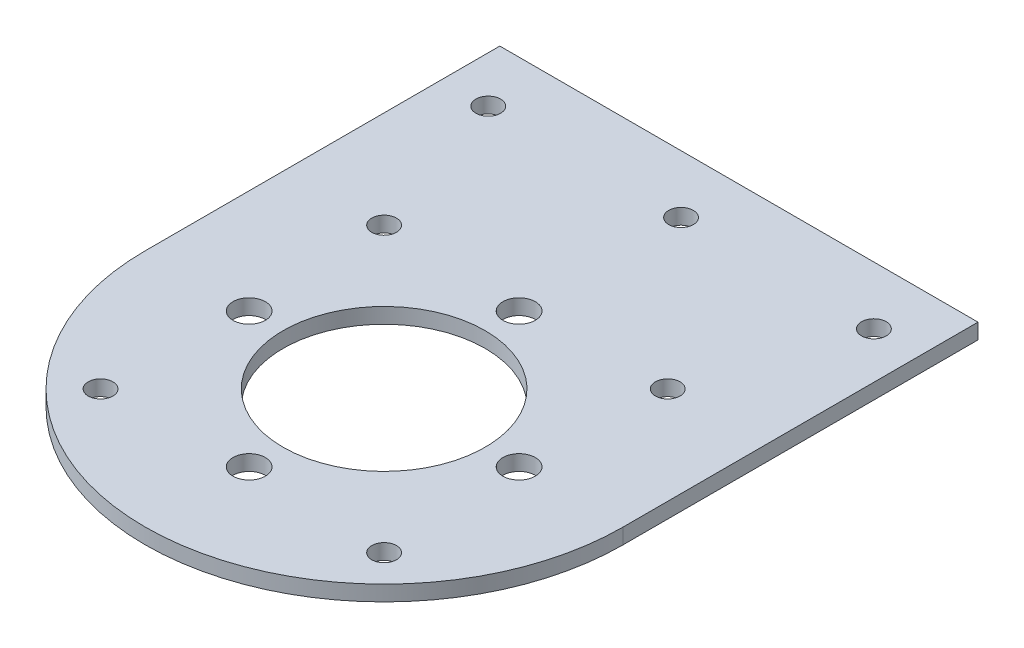
ISO-10303-21;
HEADER;
FILE_DESCRIPTION(('STEP AP214'),'2;1');
FILE_NAME('part.step','',(''),(''),'','','');
FILE_SCHEMA(('AUTOMOTIVE_DESIGN { 1 0 10303 214 1 1 1 1 }'));
ENDSEC;
DATA;
#1=APPLICATION_CONTEXT('core data for automotive mechanical design processes');
#2=APPLICATION_PROTOCOL_DEFINITION('international standard','automotive_design',2000,#1);
#3=PRODUCT_CONTEXT('',#1,'mechanical');
#4=PRODUCT('Part','Part','',(#3));
#5=PRODUCT_RELATED_PRODUCT_CATEGORY('part','',(#4));
#6=PRODUCT_DEFINITION_FORMATION('','',#4);
#7=PRODUCT_DEFINITION_CONTEXT('part definition',#1,'design');
#8=PRODUCT_DEFINITION('design','',#6,#7);
#9=PRODUCT_DEFINITION_SHAPE('','',#8);
#10=(LENGTH_UNIT() NAMED_UNIT(*) SI_UNIT(.MILLI.,.METRE.));
#11=(NAMED_UNIT(*) PLANE_ANGLE_UNIT() SI_UNIT($,.RADIAN.));
#12=(NAMED_UNIT(*) SI_UNIT($,.STERADIAN.) SOLID_ANGLE_UNIT());
#13=UNCERTAINTY_MEASURE_WITH_UNIT(LENGTH_MEASURE(1.E-05),#10,'distance_accuracy_value','');
#14=(GEOMETRIC_REPRESENTATION_CONTEXT(3) GLOBAL_UNCERTAINTY_ASSIGNED_CONTEXT((#13)) GLOBAL_UNIT_ASSIGNED_CONTEXT((#10,
#11,#12)) REPRESENTATION_CONTEXT('',''));
#15=CARTESIAN_POINT('',(0.,0.,0.));
#16=DIRECTION('',(0.,0.,1.));
#17=DIRECTION('',(1.,0.,0.));
#18=AXIS2_PLACEMENT_3D('',#15,#16,#17);
#19=CARTESIAN_POINT('',(-31.,2.,0.));
#20=DIRECTION('',(-1.,0.,0.));
#21=DIRECTION('',(0.,0.,1.));
#22=AXIS2_PLACEMENT_3D('',#19,#20,#21);
#23=PLANE('',#22);
#24=DIRECTION('',(0.,0.,-1.));
#25=VECTOR('',#24,1.);
#26=CARTESIAN_POINT('',(-31.,0.,0.));
#27=LINE('',#26,#25);
#28=CARTESIAN_POINT('',(-31.,0.,0.));
#29=VERTEX_POINT('',#28);
#30=CARTESIAN_POINT('',(-31.,0.,-46.));
#31=VERTEX_POINT('',#30);
#32=EDGE_CURVE('E164',#29,#31,#27,.T.);
#33=ORIENTED_EDGE('',*,*,#32,.F.);
#34=DIRECTION('',(0.,-1.,0.));
#35=VECTOR('',#34,1.);
#36=CARTESIAN_POINT('',(-31.,2.,0.));
#37=LINE('',#36,#35);
#38=CARTESIAN_POINT('',(-31.,2.,0.));
#39=VERTEX_POINT('',#38);
#40=EDGE_CURVE('E11',#39,#29,#37,.T.);
#41=ORIENTED_EDGE('',*,*,#40,.F.);
#42=DIRECTION('',(0.,0.,-1.));
#43=VECTOR('',#42,1.);
#44=CARTESIAN_POINT('',(-31.,2.,0.));
#45=LINE('',#44,#43);
#46=CARTESIAN_POINT('',(-31.,2.,-46.));
#47=VERTEX_POINT('',#46);
#48=EDGE_CURVE('E97',#39,#47,#45,.T.);
#49=ORIENTED_EDGE('',*,*,#48,.T.);
#50=DIRECTION('',(0.,-1.,0.));
#51=VECTOR('',#50,1.);
#52=CARTESIAN_POINT('',(-31.,2.,-46.));
#53=LINE('',#52,#51);
#54=EDGE_CURVE('E64',#47,#31,#53,.T.);
#55=ORIENTED_EDGE('',*,*,#54,.T.);
#56=EDGE_LOOP('',(#33,#41,#49,#55));
#57=FACE_BOUND('',#56,.T.);
#58=ADVANCED_FACE('F46',(#57),#23,.T.);
#59=CARTESIAN_POINT('',(0.,2.,0.));
#60=DIRECTION('',(0.,-1.,0.));
#61=DIRECTION('',(0.,0.,-1.));
#62=AXIS2_PLACEMENT_3D('',#59,#60,#61);
#63=CYLINDRICAL_SURFACE('',#62,31.);
#64=CARTESIAN_POINT('',(0.,0.,0.));
#65=DIRECTION('',(0.,1.,0.));
#66=DIRECTION('',(0.,0.,1.));
#67=AXIS2_PLACEMENT_3D('',#64,#65,#66);
#68=CIRCLE('',#67,31.);
#69=CARTESIAN_POINT('',(31.,0.,0.));
#70=VERTEX_POINT('',#69);
#71=EDGE_CURVE('E104',#29,#70,#68,.T.);
#72=ORIENTED_EDGE('',*,*,#71,.T.);
#73=DIRECTION('',(0.,-1.,0.));
#74=VECTOR('',#73,1.);
#75=CARTESIAN_POINT('',(31.,2.,0.));
#76=LINE('',#75,#74);
#77=CARTESIAN_POINT('',(31.,2.,0.));
#78=VERTEX_POINT('',#77);
#79=EDGE_CURVE('E56',#78,#70,#76,.T.);
#80=ORIENTED_EDGE('',*,*,#79,.F.);
#81=CARTESIAN_POINT('',(0.,2.,0.));
#82=DIRECTION('',(0.,1.,0.));
#83=DIRECTION('',(0.,0.,1.));
#84=AXIS2_PLACEMENT_3D('',#81,#82,#83);
#85=CIRCLE('',#84,31.);
#86=EDGE_CURVE('E90',#39,#78,#85,.T.);
#87=ORIENTED_EDGE('',*,*,#86,.F.);
#88=ORIENTED_EDGE('',*,*,#40,.T.);
#89=EDGE_LOOP('',(#72,#80,#87,#88));
#90=FACE_BOUND('',#89,.T.);
#91=ADVANCED_FACE('F102',(#90),#63,.T.);
#92=CARTESIAN_POINT('',(31.,2.,0.));
#93=DIRECTION('',(1.,0.,0.));
#94=DIRECTION('',(0.,0.,-1.));
#95=AXIS2_PLACEMENT_3D('',#92,#93,#94);
#96=PLANE('',#95);
#97=DIRECTION('',(0.,0.,1.));
#98=VECTOR('',#97,1.);
#99=CARTESIAN_POINT('',(31.,0.,0.));
#100=LINE('',#99,#98);
#101=CARTESIAN_POINT('',(31.,0.,-46.));
#102=VERTEX_POINT('',#101);
#103=EDGE_CURVE('E169',#102,#70,#100,.T.);
#104=ORIENTED_EDGE('',*,*,#103,.F.);
#105=DIRECTION('',(0.,-1.,0.));
#106=VECTOR('',#105,1.);
#107=CARTESIAN_POINT('',(31.,2.,-46.));
#108=LINE('',#107,#106);
#109=CARTESIAN_POINT('',(31.,2.,-46.));
#110=VERTEX_POINT('',#109);
#111=EDGE_CURVE('E77',#110,#102,#108,.T.);
#112=ORIENTED_EDGE('',*,*,#111,.F.);
#113=DIRECTION('',(0.,0.,1.));
#114=VECTOR('',#113,1.);
#115=CARTESIAN_POINT('',(31.,2.,0.));
#116=LINE('',#115,#114);
#117=EDGE_CURVE('E96',#110,#78,#116,.T.);
#118=ORIENTED_EDGE('',*,*,#117,.T.);
#119=ORIENTED_EDGE('',*,*,#79,.T.);
#120=EDGE_LOOP('',(#104,#112,#118,#119));
#121=FACE_BOUND('',#120,.T.);
#122=ADVANCED_FACE('F108',(#121),#96,.T.);
#123=CARTESIAN_POINT('',(0.,2.,-17.5));
#124=DIRECTION('',(0.,-1.,0.));
#125=DIRECTION('',(0.,0.,-1.));
#126=AXIS2_PLACEMENT_3D('',#123,#124,#125);
#127=CYLINDRICAL_SURFACE('',#126,2.1);
#128=CARTESIAN_POINT('',(0.,2.,-17.5));
#129=DIRECTION('',(0.,1.,0.));
#130=DIRECTION('',(0.,0.,1.));
#131=AXIS2_PLACEMENT_3D('',#128,#129,#130);
#132=CIRCLE('',#131,2.1);
#133=CARTESIAN_POINT('',(0.,2.,-15.4));
#134=VERTEX_POINT('',#133);
#135=EDGE_CURVE('E144',#134,#134,#132,.T.);
#136=ORIENTED_EDGE('',*,*,#135,.T.);
#137=EDGE_LOOP('',(#136));
#138=FACE_BOUND('',#137,.T.);
#139=CARTESIAN_POINT('',(0.,0.,-17.5));
#140=DIRECTION('',(0.,1.,0.));
#141=DIRECTION('',(0.,0.,1.));
#142=AXIS2_PLACEMENT_3D('',#139,#140,#141);
#143=CIRCLE('',#142,2.1);
#144=CARTESIAN_POINT('',(0.,0.,-15.4));
#145=VERTEX_POINT('',#144);
#146=EDGE_CURVE('E204',#145,#145,#143,.T.);
#147=ORIENTED_EDGE('',*,*,#146,.F.);
#148=EDGE_LOOP('',(#147));
#149=FACE_BOUND('',#148,.T.);
#150=ADVANCED_FACE('F288',(#138,#149),#127,.F.);
#151=CARTESIAN_POINT('',(-17.5,2.,0.));
#152=DIRECTION('',(0.,-1.,0.));
#153=DIRECTION('',(0.,0.,-1.));
#154=AXIS2_PLACEMENT_3D('',#151,#152,#153);
#155=CYLINDRICAL_SURFACE('',#154,2.1);
#156=CARTESIAN_POINT('',(-17.5,2.,0.));
#157=DIRECTION('',(0.,1.,0.));
#158=DIRECTION('',(0.,0.,1.));
#159=AXIS2_PLACEMENT_3D('',#156,#157,#158);
#160=CIRCLE('',#159,2.1);
#161=CARTESIAN_POINT('',(-17.5,2.,2.1));
#162=VERTEX_POINT('',#161);
#163=EDGE_CURVE('E140',#162,#162,#160,.T.);
#164=ORIENTED_EDGE('',*,*,#163,.T.);
#165=EDGE_LOOP('',(#164));
#166=FACE_BOUND('',#165,.T.);
#167=CARTESIAN_POINT('',(-17.5,0.,0.));
#168=DIRECTION('',(0.,1.,0.));
#169=DIRECTION('',(0.,0.,1.));
#170=AXIS2_PLACEMENT_3D('',#167,#168,#169);
#171=CIRCLE('',#170,2.1);
#172=CARTESIAN_POINT('',(-17.5,0.,2.1));
#173=VERTEX_POINT('',#172);
#174=EDGE_CURVE('E200',#173,#173,#171,.T.);
#175=ORIENTED_EDGE('',*,*,#174,.F.);
#176=EDGE_LOOP('',(#175));
#177=FACE_BOUND('',#176,.T.);
#178=ADVANCED_FACE('F290',(#166,#177),#155,.F.);
#179=CARTESIAN_POINT('',(0.,2.,17.5));
#180=DIRECTION('',(0.,-1.,0.));
#181=DIRECTION('',(0.,0.,-1.));
#182=AXIS2_PLACEMENT_3D('',#179,#180,#181);
#183=CYLINDRICAL_SURFACE('',#182,2.1);
#184=CARTESIAN_POINT('',(0.,2.,17.5));
#185=DIRECTION('',(0.,1.,0.));
#186=DIRECTION('',(0.,0.,1.));
#187=AXIS2_PLACEMENT_3D('',#184,#185,#186);
#188=CIRCLE('',#187,2.1);
#189=CARTESIAN_POINT('',(0.,2.,19.6));
#190=VERTEX_POINT('',#189);
#191=EDGE_CURVE('E136',#190,#190,#188,.T.);
#192=ORIENTED_EDGE('',*,*,#191,.T.);
#193=EDGE_LOOP('',(#192));
#194=FACE_BOUND('',#193,.T.);
#195=CARTESIAN_POINT('',(0.,0.,17.5));
#196=DIRECTION('',(0.,1.,0.));
#197=DIRECTION('',(0.,0.,1.));
#198=AXIS2_PLACEMENT_3D('',#195,#196,#197);
#199=CIRCLE('',#198,2.1);
#200=CARTESIAN_POINT('',(0.,0.,19.6));
#201=VERTEX_POINT('',#200);
#202=EDGE_CURVE('E196',#201,#201,#199,.T.);
#203=ORIENTED_EDGE('',*,*,#202,.F.);
#204=EDGE_LOOP('',(#203));
#205=FACE_BOUND('',#204,.T.);
#206=ADVANCED_FACE('F297',(#194,#205),#183,.F.);
#207=CARTESIAN_POINT('',(17.5,2.,0.));
#208=DIRECTION('',(0.,-1.,0.));
#209=DIRECTION('',(0.,0.,-1.));
#210=AXIS2_PLACEMENT_3D('',#207,#208,#209);
#211=CYLINDRICAL_SURFACE('',#210,2.1);
#212=CARTESIAN_POINT('',(17.5,2.,0.));
#213=DIRECTION('',(0.,1.,0.));
#214=DIRECTION('',(0.,0.,1.));
#215=AXIS2_PLACEMENT_3D('',#212,#213,#214);
#216=CIRCLE('',#215,2.1);
#217=CARTESIAN_POINT('',(17.5,2.,2.1));
#218=VERTEX_POINT('',#217);
#219=EDGE_CURVE('E132',#218,#218,#216,.T.);
#220=ORIENTED_EDGE('',*,*,#219,.T.);
#221=EDGE_LOOP('',(#220));
#222=FACE_BOUND('',#221,.T.);
#223=CARTESIAN_POINT('',(17.5,0.,0.));
#224=DIRECTION('',(0.,1.,0.));
#225=DIRECTION('',(0.,0.,1.));
#226=AXIS2_PLACEMENT_3D('',#223,#224,#225);
#227=CIRCLE('',#226,2.1);
#228=CARTESIAN_POINT('',(17.5,0.,2.1));
#229=VERTEX_POINT('',#228);
#230=EDGE_CURVE('E192',#229,#229,#227,.T.);
#231=ORIENTED_EDGE('',*,*,#230,.F.);
#232=EDGE_LOOP('',(#231));
#233=FACE_BOUND('',#232,.T.);
#234=ADVANCED_FACE('F304',(#222,#233),#211,.F.);
#235=CARTESIAN_POINT('',(18.3847763108503,2.,-18.3847763108502));
#236=DIRECTION('',(0.,-1.,0.));
#237=DIRECTION('',(0.,0.,-1.));
#238=AXIS2_PLACEMENT_3D('',#235,#236,#237);
#239=CYLINDRICAL_SURFACE('',#238,1.60000000000001);
#240=CARTESIAN_POINT('',(18.3847763108503,2.,-18.3847763108502));
#241=DIRECTION('',(0.,1.,0.));
#242=DIRECTION('',(0.,0.,1.));
#243=AXIS2_PLACEMENT_3D('',#240,#241,#242);
#244=CIRCLE('',#243,1.60000000000001);
#245=CARTESIAN_POINT('',(18.3847763108503,2.,-16.7847763108502));
#246=VERTEX_POINT('',#245);
#247=EDGE_CURVE('E128',#246,#246,#244,.T.);
#248=ORIENTED_EDGE('',*,*,#247,.T.);
#249=EDGE_LOOP('',(#248));
#250=FACE_BOUND('',#249,.T.);
#251=CARTESIAN_POINT('',(18.3847763108503,0.,-18.3847763108502));
#252=DIRECTION('',(0.,1.,0.));
#253=DIRECTION('',(0.,0.,1.));
#254=AXIS2_PLACEMENT_3D('',#251,#252,#253);
#255=CIRCLE('',#254,1.60000000000001);
#256=CARTESIAN_POINT('',(18.3847763108503,0.,-16.7847763108502));
#257=VERTEX_POINT('',#256);
#258=EDGE_CURVE('E188',#257,#257,#255,.T.);
#259=ORIENTED_EDGE('',*,*,#258,.F.);
#260=EDGE_LOOP('',(#259));
#261=FACE_BOUND('',#260,.T.);
#262=ADVANCED_FACE('F308',(#250,#261),#239,.F.);
#263=CARTESIAN_POINT('',(18.3847763108501,2.,18.3847763108503));
#264=DIRECTION('',(0.,-1.,0.));
#265=DIRECTION('',(0.,0.,-1.));
#266=AXIS2_PLACEMENT_3D('',#263,#264,#265);
#267=CYLINDRICAL_SURFACE('',#266,1.6);
#268=CARTESIAN_POINT('',(18.3847763108501,2.,18.3847763108503));
#269=DIRECTION('',(0.,1.,0.));
#270=DIRECTION('',(0.,0.,1.));
#271=AXIS2_PLACEMENT_3D('',#268,#269,#270);
#272=CIRCLE('',#271,1.6);
#273=CARTESIAN_POINT('',(18.3847763108501,2.,19.9847763108503));
#274=VERTEX_POINT('',#273);
#275=EDGE_CURVE('E124',#274,#274,#272,.T.);
#276=ORIENTED_EDGE('',*,*,#275,.T.);
#277=EDGE_LOOP('',(#276));
#278=FACE_BOUND('',#277,.T.);
#279=CARTESIAN_POINT('',(18.3847763108501,0.,18.3847763108503));
#280=DIRECTION('',(0.,1.,0.));
#281=DIRECTION('',(0.,0.,1.));
#282=AXIS2_PLACEMENT_3D('',#279,#280,#281);
#283=CIRCLE('',#282,1.6);
#284=CARTESIAN_POINT('',(18.3847763108501,0.,19.9847763108503));
#285=VERTEX_POINT('',#284);
#286=EDGE_CURVE('E184',#285,#285,#283,.T.);
#287=ORIENTED_EDGE('',*,*,#286,.F.);
#288=EDGE_LOOP('',(#287));
#289=FACE_BOUND('',#288,.T.);
#290=ADVANCED_FACE('F312',(#278,#289),#267,.F.);
#291=CARTESIAN_POINT('',(-18.3847763108504,2.,18.3847763108501));
#292=DIRECTION('',(0.,-1.,0.));
#293=DIRECTION('',(0.,0.,-1.));
#294=AXIS2_PLACEMENT_3D('',#291,#292,#293);
#295=CYLINDRICAL_SURFACE('',#294,1.6);
#296=CARTESIAN_POINT('',(-18.3847763108504,2.,18.3847763108501));
#297=DIRECTION('',(0.,1.,0.));
#298=DIRECTION('',(0.,0.,1.));
#299=AXIS2_PLACEMENT_3D('',#296,#297,#298);
#300=CIRCLE('',#299,1.6);
#301=CARTESIAN_POINT('',(-18.3847763108504,2.,19.9847763108501));
#302=VERTEX_POINT('',#301);
#303=EDGE_CURVE('E120',#302,#302,#300,.T.);
#304=ORIENTED_EDGE('',*,*,#303,.T.);
#305=EDGE_LOOP('',(#304));
#306=FACE_BOUND('',#305,.T.);
#307=CARTESIAN_POINT('',(-18.3847763108504,0.,18.3847763108501));
#308=DIRECTION('',(0.,1.,0.));
#309=DIRECTION('',(0.,0.,1.));
#310=AXIS2_PLACEMENT_3D('',#307,#308,#309);
#311=CIRCLE('',#310,1.6);
#312=CARTESIAN_POINT('',(-18.3847763108504,0.,19.9847763108501));
#313=VERTEX_POINT('',#312);
#314=EDGE_CURVE('E180',#313,#313,#311,.T.);
#315=ORIENTED_EDGE('',*,*,#314,.F.);
#316=EDGE_LOOP('',(#315));
#317=FACE_BOUND('',#316,.T.);
#318=ADVANCED_FACE('F244',(#306,#317),#295,.F.);
#319=CARTESIAN_POINT('',(-18.38477631085,2.,-18.3847763108505));
#320=DIRECTION('',(0.,-1.,0.));
#321=DIRECTION('',(0.,0.,-1.));
#322=AXIS2_PLACEMENT_3D('',#319,#320,#321);
#323=CYLINDRICAL_SURFACE('',#322,1.6);
#324=CARTESIAN_POINT('',(-18.38477631085,2.,-18.3847763108505));
#325=DIRECTION('',(0.,1.,0.));
#326=DIRECTION('',(0.,0.,1.));
#327=AXIS2_PLACEMENT_3D('',#324,#325,#326);
#328=CIRCLE('',#327,1.6);
#329=CARTESIAN_POINT('',(-18.38477631085,2.,-16.7847763108505));
#330=VERTEX_POINT('',#329);
#331=EDGE_CURVE('E113',#330,#330,#328,.T.);
#332=ORIENTED_EDGE('',*,*,#331,.T.);
#333=EDGE_LOOP('',(#332));
#334=FACE_BOUND('',#333,.T.);
#335=CARTESIAN_POINT('',(-18.38477631085,0.,-18.3847763108505));
#336=DIRECTION('',(0.,1.,0.));
#337=DIRECTION('',(0.,0.,1.));
#338=AXIS2_PLACEMENT_3D('',#335,#336,#337);
#339=CIRCLE('',#338,1.6);
#340=CARTESIAN_POINT('',(-18.38477631085,0.,-16.7847763108505));
#341=VERTEX_POINT('',#340);
#342=EDGE_CURVE('E176',#341,#341,#339,.T.);
#343=ORIENTED_EDGE('',*,*,#342,.F.);
#344=EDGE_LOOP('',(#343));
#345=FACE_BOUND('',#344,.T.);
#346=ADVANCED_FACE('F235',(#334,#345),#323,.F.);
#347=CARTESIAN_POINT('',(0.,2.,-46.));
#348=DIRECTION('',(0.,0.,-1.));
#349=DIRECTION('',(-1.,0.,0.));
#350=AXIS2_PLACEMENT_3D('',#347,#348,#349);
#351=PLANE('',#350);
#352=DIRECTION('',(1.,0.,0.));
#353=VECTOR('',#352,1.);
#354=CARTESIAN_POINT('',(0.,0.,-46.));
#355=LINE('',#354,#353);
#356=EDGE_CURVE('E172',#31,#102,#355,.T.);
#357=ORIENTED_EDGE('',*,*,#356,.F.);
#358=ORIENTED_EDGE('',*,*,#54,.F.);
#359=DIRECTION('',(1.,0.,0.));
#360=VECTOR('',#359,1.);
#361=CARTESIAN_POINT('',(0.,2.,-46.));
#362=LINE('',#361,#360);
#363=EDGE_CURVE('E110',#47,#110,#362,.T.);
#364=ORIENTED_EDGE('',*,*,#363,.T.);
#365=ORIENTED_EDGE('',*,*,#111,.T.);
#366=EDGE_LOOP('',(#357,#358,#364,#365));
#367=FACE_BOUND('',#366,.T.);
#368=ADVANCED_FACE('F232',(#367),#351,.T.);
#369=CARTESIAN_POINT('',(-25.,2.,-38.5));
#370=DIRECTION('',(0.,-1.,0.));
#371=DIRECTION('',(0.,0.,-1.));
#372=AXIS2_PLACEMENT_3D('',#369,#370,#371);
#373=CYLINDRICAL_SURFACE('',#372,1.6);
#374=CARTESIAN_POINT('',(-25.,2.,-38.5));
#375=DIRECTION('',(0.,1.,0.));
#376=DIRECTION('',(0.,0.,1.));
#377=AXIS2_PLACEMENT_3D('',#374,#375,#376);
#378=CIRCLE('',#377,1.6);
#379=CARTESIAN_POINT('',(-25.,2.,-36.9));
#380=VERTEX_POINT('',#379);
#381=EDGE_CURVE('E226',#380,#380,#378,.T.);
#382=ORIENTED_EDGE('',*,*,#381,.T.);
#383=EDGE_LOOP('',(#382));
#384=FACE_BOUND('',#383,.T.);
#385=CARTESIAN_POINT('',(-25.,0.,-38.5));
#386=DIRECTION('',(0.,1.,0.));
#387=DIRECTION('',(0.,0.,1.));
#388=AXIS2_PLACEMENT_3D('',#385,#386,#387);
#389=CIRCLE('',#388,1.6);
#390=CARTESIAN_POINT('',(-25.,0.,-36.9));
#391=VERTEX_POINT('',#390);
#392=EDGE_CURVE('E160',#391,#391,#389,.T.);
#393=ORIENTED_EDGE('',*,*,#392,.F.);
#394=EDGE_LOOP('',(#393));
#395=FACE_BOUND('',#394,.T.);
#396=ADVANCED_FACE('F234',(#384,#395),#373,.F.);
#397=CARTESIAN_POINT('',(0.,2.,-38.5));
#398=DIRECTION('',(0.,-1.,0.));
#399=DIRECTION('',(0.,0.,-1.));
#400=AXIS2_PLACEMENT_3D('',#397,#398,#399);
#401=CYLINDRICAL_SURFACE('',#400,1.6);
#402=CARTESIAN_POINT('',(0.,2.,-38.5));
#403=DIRECTION('',(0.,1.,0.));
#404=DIRECTION('',(0.,0.,1.));
#405=AXIS2_PLACEMENT_3D('',#402,#403,#404);
#406=CIRCLE('',#405,1.6);
#407=CARTESIAN_POINT('',(0.,2.,-36.9));
#408=VERTEX_POINT('',#407);
#409=EDGE_CURVE('E220',#408,#408,#406,.T.);
#410=ORIENTED_EDGE('',*,*,#409,.T.);
#411=EDGE_LOOP('',(#410));
#412=FACE_BOUND('',#411,.T.);
#413=CARTESIAN_POINT('',(0.,0.,-38.5));
#414=DIRECTION('',(0.,1.,0.));
#415=DIRECTION('',(0.,0.,1.));
#416=AXIS2_PLACEMENT_3D('',#413,#414,#415);
#417=CIRCLE('',#416,1.6);
#418=CARTESIAN_POINT('',(0.,0.,-36.9));
#419=VERTEX_POINT('',#418);
#420=EDGE_CURVE('E156',#419,#419,#417,.T.);
#421=ORIENTED_EDGE('',*,*,#420,.F.);
#422=EDGE_LOOP('',(#421));
#423=FACE_BOUND('',#422,.T.);
#424=ADVANCED_FACE('F241',(#412,#423),#401,.F.);
#425=CARTESIAN_POINT('',(25.,2.,-38.5));
#426=DIRECTION('',(0.,-1.,0.));
#427=DIRECTION('',(0.,0.,-1.));
#428=AXIS2_PLACEMENT_3D('',#425,#426,#427);
#429=CYLINDRICAL_SURFACE('',#428,1.6);
#430=CARTESIAN_POINT('',(25.,2.,-38.5));
#431=DIRECTION('',(0.,1.,0.));
#432=DIRECTION('',(0.,0.,1.));
#433=AXIS2_PLACEMENT_3D('',#430,#431,#432);
#434=CIRCLE('',#433,1.6);
#435=CARTESIAN_POINT('',(25.,2.,-36.9));
#436=VERTEX_POINT('',#435);
#437=EDGE_CURVE('E212',#436,#436,#434,.T.);
#438=ORIENTED_EDGE('',*,*,#437,.T.);
#439=EDGE_LOOP('',(#438));
#440=FACE_BOUND('',#439,.T.);
#441=CARTESIAN_POINT('',(25.,0.,-38.5));
#442=DIRECTION('',(0.,1.,0.));
#443=DIRECTION('',(0.,0.,1.));
#444=AXIS2_PLACEMENT_3D('',#441,#442,#443);
#445=CIRCLE('',#444,1.6);
#446=CARTESIAN_POINT('',(25.,0.,-36.9));
#447=VERTEX_POINT('',#446);
#448=EDGE_CURVE('E152',#447,#447,#445,.T.);
#449=ORIENTED_EDGE('',*,*,#448,.F.);
#450=EDGE_LOOP('',(#449));
#451=FACE_BOUND('',#450,.T.);
#452=ADVANCED_FACE('F48',(#440,#451),#429,.F.);
#453=CARTESIAN_POINT('',(0.,2.,0.));
#454=DIRECTION('',(0.,-1.,0.));
#455=DIRECTION('',(0.,0.,-1.));
#456=AXIS2_PLACEMENT_3D('',#453,#454,#455);
#457=CYLINDRICAL_SURFACE('',#456,13.1);
#458=CARTESIAN_POINT('',(0.,2.,0.));
#459=DIRECTION('',(0.,1.,0.));
#460=DIRECTION('',(0.,0.,1.));
#461=AXIS2_PLACEMENT_3D('',#458,#459,#460);
#462=CIRCLE('',#461,13.1);
#463=CARTESIAN_POINT('',(0.,2.,13.1));
#464=VERTEX_POINT('',#463);
#465=EDGE_CURVE('E148',#464,#464,#462,.T.);
#466=ORIENTED_EDGE('',*,*,#465,.T.);
#467=EDGE_LOOP('',(#466));
#468=FACE_BOUND('',#467,.T.);
#469=CARTESIAN_POINT('',(0.,0.,0.));
#470=DIRECTION('',(0.,1.,0.));
#471=DIRECTION('',(0.,0.,1.));
#472=AXIS2_PLACEMENT_3D('',#469,#470,#471);
#473=CIRCLE('',#472,13.1);
#474=CARTESIAN_POINT('',(0.,0.,13.1));
#475=VERTEX_POINT('',#474);
#476=EDGE_CURVE('E208',#475,#475,#473,.T.);
#477=ORIENTED_EDGE('',*,*,#476,.F.);
#478=EDGE_LOOP('',(#477));
#479=FACE_BOUND('',#478,.T.);
#480=ADVANCED_FACE('F259',(#468,#479),#457,.F.);
#481=CARTESIAN_POINT('',(0.,2.,0.));
#482=DIRECTION('',(0.,1.,0.));
#483=DIRECTION('',(0.,0.,1.));
#484=AXIS2_PLACEMENT_3D('',#481,#482,#483);
#485=PLANE('',#484);
#486=ORIENTED_EDGE('',*,*,#437,.F.);
#487=EDGE_LOOP('',(#486));
#488=FACE_BOUND('',#487,.T.);
#489=ORIENTED_EDGE('',*,*,#409,.F.);
#490=EDGE_LOOP('',(#489));
#491=FACE_BOUND('',#490,.T.);
#492=ORIENTED_EDGE('',*,*,#381,.F.);
#493=EDGE_LOOP('',(#492));
#494=FACE_BOUND('',#493,.T.);
#495=ORIENTED_EDGE('',*,*,#48,.F.);
#496=ORIENTED_EDGE('',*,*,#86,.T.);
#497=ORIENTED_EDGE('',*,*,#117,.F.);
#498=ORIENTED_EDGE('',*,*,#363,.F.);
#499=EDGE_LOOP('',(#495,#496,#497,#498));
#500=FACE_BOUND('',#499,.T.);
#501=ORIENTED_EDGE('',*,*,#331,.F.);
#502=EDGE_LOOP('',(#501));
#503=FACE_BOUND('',#502,.T.);
#504=ORIENTED_EDGE('',*,*,#303,.F.);
#505=EDGE_LOOP('',(#504));
#506=FACE_BOUND('',#505,.T.);
#507=ORIENTED_EDGE('',*,*,#275,.F.);
#508=EDGE_LOOP('',(#507));
#509=FACE_BOUND('',#508,.T.);
#510=ORIENTED_EDGE('',*,*,#247,.F.);
#511=EDGE_LOOP('',(#510));
#512=FACE_BOUND('',#511,.T.);
#513=ORIENTED_EDGE('',*,*,#219,.F.);
#514=EDGE_LOOP('',(#513));
#515=FACE_BOUND('',#514,.T.);
#516=ORIENTED_EDGE('',*,*,#191,.F.);
#517=EDGE_LOOP('',(#516));
#518=FACE_BOUND('',#517,.T.);
#519=ORIENTED_EDGE('',*,*,#163,.F.);
#520=EDGE_LOOP('',(#519));
#521=FACE_BOUND('',#520,.T.);
#522=ORIENTED_EDGE('',*,*,#135,.F.);
#523=EDGE_LOOP('',(#522));
#524=FACE_BOUND('',#523,.T.);
#525=ORIENTED_EDGE('',*,*,#465,.F.);
#526=EDGE_LOOP('',(#525));
#527=FACE_BOUND('',#526,.T.);
#528=ADVANCED_FACE('F92',(#488,#491,#494,#500,#503,#506,#509,#512,#515,#518,#521,#524,#527),
#485,.T.);
#529=CARTESIAN_POINT('',(0.,0.,0.));
#530=DIRECTION('',(0.,1.,0.));
#531=DIRECTION('',(0.,0.,1.));
#532=AXIS2_PLACEMENT_3D('',#529,#530,#531);
#533=PLANE('',#532);
#534=ORIENTED_EDGE('',*,*,#448,.T.);
#535=EDGE_LOOP('',(#534));
#536=FACE_BOUND('',#535,.T.);
#537=ORIENTED_EDGE('',*,*,#420,.T.);
#538=EDGE_LOOP('',(#537));
#539=FACE_BOUND('',#538,.T.);
#540=ORIENTED_EDGE('',*,*,#392,.T.);
#541=EDGE_LOOP('',(#540));
#542=FACE_BOUND('',#541,.T.);
#543=ORIENTED_EDGE('',*,*,#32,.T.);
#544=ORIENTED_EDGE('',*,*,#356,.T.);
#545=ORIENTED_EDGE('',*,*,#103,.T.);
#546=ORIENTED_EDGE('',*,*,#71,.F.);
#547=EDGE_LOOP('',(#543,#544,#545,#546));
#548=FACE_BOUND('',#547,.T.);
#549=ORIENTED_EDGE('',*,*,#342,.T.);
#550=EDGE_LOOP('',(#549));
#551=FACE_BOUND('',#550,.T.);
#552=ORIENTED_EDGE('',*,*,#314,.T.);
#553=EDGE_LOOP('',(#552));
#554=FACE_BOUND('',#553,.T.);
#555=ORIENTED_EDGE('',*,*,#286,.T.);
#556=EDGE_LOOP('',(#555));
#557=FACE_BOUND('',#556,.T.);
#558=ORIENTED_EDGE('',*,*,#258,.T.);
#559=EDGE_LOOP('',(#558));
#560=FACE_BOUND('',#559,.T.);
#561=ORIENTED_EDGE('',*,*,#230,.T.);
#562=EDGE_LOOP('',(#561));
#563=FACE_BOUND('',#562,.T.);
#564=ORIENTED_EDGE('',*,*,#202,.T.);
#565=EDGE_LOOP('',(#564));
#566=FACE_BOUND('',#565,.T.);
#567=ORIENTED_EDGE('',*,*,#174,.T.);
#568=EDGE_LOOP('',(#567));
#569=FACE_BOUND('',#568,.T.);
#570=ORIENTED_EDGE('',*,*,#146,.T.);
#571=EDGE_LOOP('',(#570));
#572=FACE_BOUND('',#571,.T.);
#573=ORIENTED_EDGE('',*,*,#476,.T.);
#574=EDGE_LOOP('',(#573));
#575=FACE_BOUND('',#574,.T.);
#576=ADVANCED_FACE('F264',(#536,#539,#542,#548,#551,#554,#557,#560,#563,#566,#569,#572,#575),
#533,.F.);
#577=CLOSED_SHELL('',(#58,#91,#122,#150,#178,#206,#234,#262,#290,#318,#346,#368,#396,#424,#452,
#480,#528,#576));
#578=MANIFOLD_SOLID_BREP('B2',#577);
#579=ADVANCED_BREP_SHAPE_REPRESENTATION('',(#18,#578),#14);
#580=SHAPE_DEFINITION_REPRESENTATION(#9,#579);
ENDSEC;
END-ISO-10303-21;
